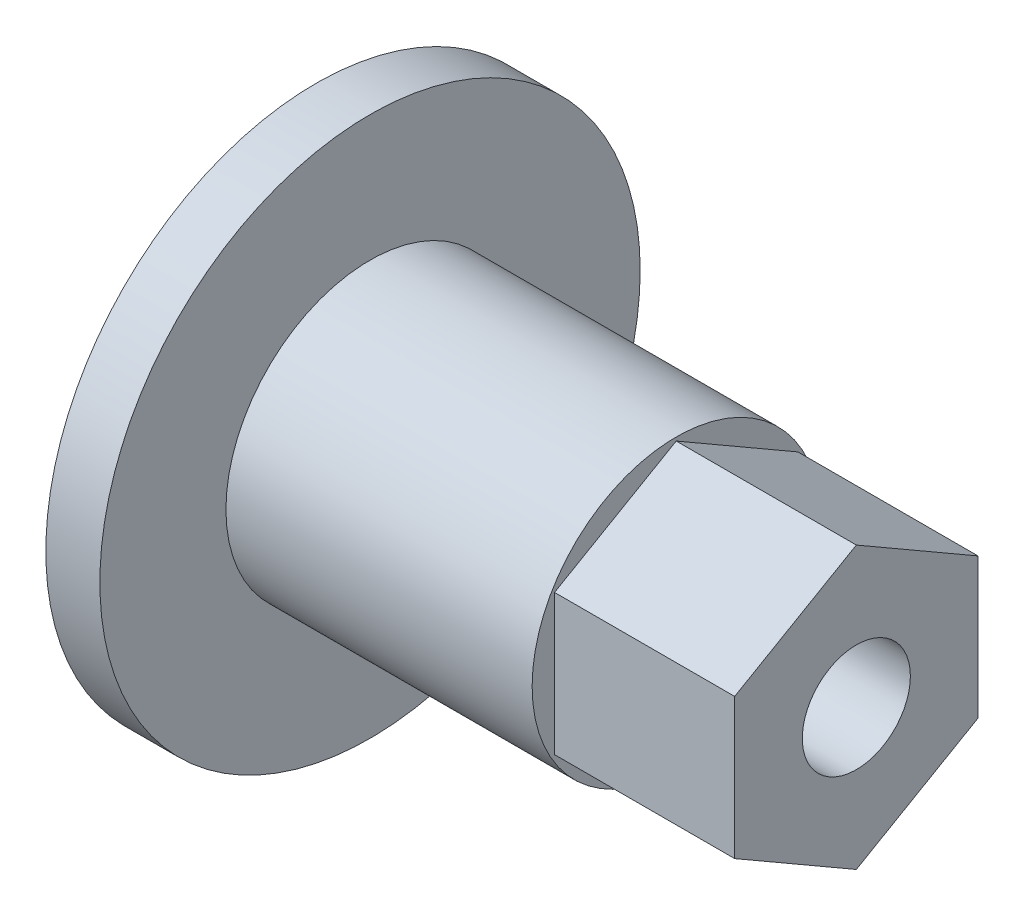
ISO-10303-21;
HEADER;
FILE_DESCRIPTION(('STEP AP214'),'2;1');
FILE_NAME('part.step','',(''),(''),'','','');
FILE_SCHEMA(('AUTOMOTIVE_DESIGN { 1 0 10303 214 1 1 1 1 }'));
ENDSEC;
DATA;
#1=APPLICATION_CONTEXT('core data for automotive mechanical design processes');
#2=APPLICATION_PROTOCOL_DEFINITION('international standard','automotive_design',2000,#1);
#3=PRODUCT_CONTEXT('',#1,'mechanical');
#4=PRODUCT('Part','Part','',(#3));
#5=PRODUCT_RELATED_PRODUCT_CATEGORY('part','',(#4));
#6=PRODUCT_DEFINITION_FORMATION('','',#4);
#7=PRODUCT_DEFINITION_CONTEXT('part definition',#1,'design');
#8=PRODUCT_DEFINITION('design','',#6,#7);
#9=PRODUCT_DEFINITION_SHAPE('','',#8);
#10=(LENGTH_UNIT() NAMED_UNIT(*) SI_UNIT(.MILLI.,.METRE.));
#11=(NAMED_UNIT(*) PLANE_ANGLE_UNIT() SI_UNIT($,.RADIAN.));
#12=(NAMED_UNIT(*) SI_UNIT($,.STERADIAN.) SOLID_ANGLE_UNIT());
#13=UNCERTAINTY_MEASURE_WITH_UNIT(LENGTH_MEASURE(1.E-05),#10,'distance_accuracy_value','');
#14=(GEOMETRIC_REPRESENTATION_CONTEXT(3) GLOBAL_UNCERTAINTY_ASSIGNED_CONTEXT((#13)) GLOBAL_UNIT_ASSIGNED_CONTEXT((#10,
#11,#12)) REPRESENTATION_CONTEXT('',''));
#15=CARTESIAN_POINT('',(0.,0.,0.));
#16=DIRECTION('',(0.,0.,1.));
#17=DIRECTION('',(1.,0.,0.));
#18=AXIS2_PLACEMENT_3D('',#15,#16,#17);
#19=CARTESIAN_POINT('',(6.50000000000001,0.,0.));
#20=DIRECTION('',(1.,0.,0.));
#21=DIRECTION('',(0.,0.,-1.));
#22=AXIS2_PLACEMENT_3D('',#19,#20,#21);
#23=CONICAL_SURFACE('',#22,1.25,1.02974425867665);
#24=CARTESIAN_POINT('',(6.50000000000001,0.,0.));
#25=DIRECTION('',(1.,0.,0.));
#26=DIRECTION('',(0.,0.,-1.));
#27=AXIS2_PLACEMENT_3D('',#24,#25,#26);
#28=CIRCLE('',#27,1.25);
#29=CARTESIAN_POINT('',(6.50000000000001,0.,-1.25));
#30=VERTEX_POINT('',#29);
#31=EDGE_CURVE('E117',#30,#30,#28,.T.);
#32=ORIENTED_EDGE('',*,*,#31,.T.);
#33=EDGE_LOOP('',(#32));
#34=FACE_BOUND('',#33,.T.);
#35=CARTESIAN_POINT('',(6.35,0.,0.));
#36=DIRECTION('',(-1.,0.,0.));
#37=DIRECTION('',(0.,0.,1.));
#38=AXIS2_PLACEMENT_3D('',#35,#36,#37);
#39=CIRCLE('',#38,1.00035807764741);
#40=CARTESIAN_POINT('',(6.35,0.,1.00035807764741));
#41=VERTEX_POINT('',#40);
#42=EDGE_CURVE('E38',#41,#41,#39,.F.);
#43=ORIENTED_EDGE('',*,*,#42,.F.);
#44=EDGE_LOOP('',(#43));
#45=FACE_BOUND('',#44,.T.);
#46=ADVANCED_FACE('F34',(#34,#45),#23,.F.);
#47=CARTESIAN_POINT('',(15.,0.,0.));
#48=DIRECTION('',(1.,0.,0.));
#49=DIRECTION('',(0.,0.,-1.));
#50=AXIS2_PLACEMENT_3D('',#47,#48,#49);
#51=CYLINDRICAL_SURFACE('',#50,4.);
#52=CARTESIAN_POINT('',(1.5,0.,0.));
#53=DIRECTION('',(1.,0.,0.));
#54=DIRECTION('',(0.,0.,-1.));
#55=AXIS2_PLACEMENT_3D('',#52,#53,#54);
#56=CIRCLE('',#55,4.);
#57=CARTESIAN_POINT('',(1.5,0.,-4.));
#58=VERTEX_POINT('',#57);
#59=EDGE_CURVE('E146',#58,#58,#56,.T.);
#60=ORIENTED_EDGE('',*,*,#59,.T.);
#61=EDGE_LOOP('',(#60));
#62=FACE_BOUND('',#61,.T.);
#63=CARTESIAN_POINT('',(10.,0.,0.));
#64=DIRECTION('',(1.,0.,0.));
#65=DIRECTION('',(0.,0.,-1.));
#66=AXIS2_PLACEMENT_3D('',#63,#64,#65);
#67=CIRCLE('',#66,4.);
#68=CARTESIAN_POINT('',(10.,0.,-4.));
#69=VERTEX_POINT('',#68);
#70=EDGE_CURVE('E138',#69,#69,#67,.F.);
#71=ORIENTED_EDGE('',*,*,#70,.T.);
#72=EDGE_LOOP('',(#71));
#73=FACE_BOUND('',#72,.T.);
#74=ADVANCED_FACE('F153',(#62,#73),#51,.T.);
#75=CARTESIAN_POINT('',(0.,0.,0.));
#76=DIRECTION('',(-1.,0.,0.));
#77=DIRECTION('',(0.,0.,1.));
#78=AXIS2_PLACEMENT_3D('',#75,#76,#77);
#79=PLANE('',#78);
#80=CARTESIAN_POINT('',(0.,0.,0.));
#81=DIRECTION('',(-1.,0.,0.));
#82=DIRECTION('',(0.,0.,1.));
#83=AXIS2_PLACEMENT_3D('',#80,#81,#82);
#84=CIRCLE('',#83,1.58496);
#85=CARTESIAN_POINT('',(0.,0.,1.58496));
#86=VERTEX_POINT('',#85);
#87=EDGE_CURVE('E225',#86,#86,#84,.T.);
#88=ORIENTED_EDGE('',*,*,#87,.F.);
#89=EDGE_LOOP('',(#88));
#90=FACE_BOUND('',#89,.T.);
#91=CARTESIAN_POINT('',(0.,0.,0.));
#92=DIRECTION('',(1.,0.,0.));
#93=DIRECTION('',(0.,0.,-1.));
#94=AXIS2_PLACEMENT_3D('',#91,#92,#93);
#95=CIRCLE('',#94,7.5);
#96=CARTESIAN_POINT('',(0.,0.,-7.5));
#97=VERTEX_POINT('',#96);
#98=EDGE_CURVE('E12',#97,#97,#95,.T.);
#99=ORIENTED_EDGE('',*,*,#98,.F.);
#100=EDGE_LOOP('',(#99));
#101=FACE_BOUND('',#100,.T.);
#102=ADVANCED_FACE('F36',(#90,#101),#79,.T.);
#103=CARTESIAN_POINT('',(15.,0.,0.));
#104=DIRECTION('',(1.,0.,0.));
#105=DIRECTION('',(0.,0.,-1.));
#106=AXIS2_PLACEMENT_3D('',#103,#104,#105);
#107=CYLINDRICAL_SURFACE('',#106,7.5);
#108=ORIENTED_EDGE('',*,*,#98,.T.);
#109=EDGE_LOOP('',(#108));
#110=FACE_BOUND('',#109,.T.);
#111=CARTESIAN_POINT('',(1.5,0.,0.));
#112=DIRECTION('',(1.,0.,0.));
#113=DIRECTION('',(0.,0.,-1.));
#114=AXIS2_PLACEMENT_3D('',#111,#112,#113);
#115=CIRCLE('',#114,7.5);
#116=CARTESIAN_POINT('',(1.5,0.,-7.5));
#117=VERTEX_POINT('',#116);
#118=EDGE_CURVE('E43',#117,#117,#115,.T.);
#119=ORIENTED_EDGE('',*,*,#118,.F.);
#120=EDGE_LOOP('',(#119));
#121=FACE_BOUND('',#120,.T.);
#122=ADVANCED_FACE('F164',(#110,#121),#107,.T.);
#123=CARTESIAN_POINT('',(1.5,0.,-7.5));
#124=DIRECTION('',(1.,0.,0.));
#125=DIRECTION('',(0.,0.,-1.));
#126=AXIS2_PLACEMENT_3D('',#123,#124,#125);
#127=PLANE('',#126);
#128=ORIENTED_EDGE('',*,*,#118,.T.);
#129=EDGE_LOOP('',(#128));
#130=FACE_BOUND('',#129,.T.);
#131=ORIENTED_EDGE('',*,*,#59,.F.);
#132=EDGE_LOOP('',(#131));
#133=FACE_BOUND('',#132,.T.);
#134=ADVANCED_FACE('F156',(#130,#133),#127,.T.);
#135=CARTESIAN_POINT('',(10.,0.,0.));
#136=DIRECTION('',(1.,0.,0.));
#137=DIRECTION('',(0.,0.,-1.));
#138=AXIS2_PLACEMENT_3D('',#135,#136,#137);
#139=PLANE('',#138);
#140=ORIENTED_EDGE('',*,*,#70,.F.);
#141=EDGE_LOOP('',(#140));
#142=FACE_BOUND('',#141,.T.);
#143=DIRECTION('',(0.,1.,0.));
#144=VECTOR('',#143,1.);
#145=CARTESIAN_POINT('',(10.,-1.95,-3.37749907475931));
#146=LINE('',#145,#144);
#147=CARTESIAN_POINT('',(10.,-1.95,-3.37749907475931));
#148=VERTEX_POINT('',#147);
#149=CARTESIAN_POINT('',(10.,1.95,-3.37749907475931));
#150=VERTEX_POINT('',#149);
#151=EDGE_CURVE('E101',#148,#150,#146,.T.);
#152=ORIENTED_EDGE('',*,*,#151,.F.);
#153=DIRECTION('',(0.,0.5,-0.866025403784439));
#154=VECTOR('',#153,1.);
#155=CARTESIAN_POINT('',(10.,-3.9,0.));
#156=LINE('',#155,#154);
#157=CARTESIAN_POINT('',(10.,-3.9,0.));
#158=VERTEX_POINT('',#157);
#159=EDGE_CURVE('E124',#158,#148,#156,.T.);
#160=ORIENTED_EDGE('',*,*,#159,.F.);
#161=DIRECTION('',(0.,-0.5,-0.866025403784438));
#162=VECTOR('',#161,1.);
#163=CARTESIAN_POINT('',(10.,-1.95,3.37749907475931));
#164=LINE('',#163,#162);
#165=CARTESIAN_POINT('',(10.,-1.95,3.37749907475931));
#166=VERTEX_POINT('',#165);
#167=EDGE_CURVE('E121',#166,#158,#164,.T.);
#168=ORIENTED_EDGE('',*,*,#167,.F.);
#169=DIRECTION('',(0.,-1.,0.));
#170=VECTOR('',#169,1.);
#171=CARTESIAN_POINT('',(10.,1.95,3.37749907475931));
#172=LINE('',#171,#170);
#173=CARTESIAN_POINT('',(10.,1.95,3.37749907475931));
#174=VERTEX_POINT('',#173);
#175=EDGE_CURVE('E59',#174,#166,#172,.T.);
#176=ORIENTED_EDGE('',*,*,#175,.F.);
#177=DIRECTION('',(0.,-0.5,0.866025403784439));
#178=VECTOR('',#177,1.);
#179=CARTESIAN_POINT('',(10.,3.9,0.));
#180=LINE('',#179,#178);
#181=CARTESIAN_POINT('',(10.,3.9,0.));
#182=VERTEX_POINT('',#181);
#183=EDGE_CURVE('E93',#182,#174,#180,.T.);
#184=ORIENTED_EDGE('',*,*,#183,.F.);
#185=DIRECTION('',(0.,0.5,0.866025403784439));
#186=VECTOR('',#185,1.);
#187=CARTESIAN_POINT('',(10.,1.95,-3.37749907475931));
#188=LINE('',#187,#186);
#189=EDGE_CURVE('E106',#150,#182,#188,.T.);
#190=ORIENTED_EDGE('',*,*,#189,.F.);
#191=EDGE_LOOP('',(#152,#160,#168,#176,#184,#190));
#192=FACE_BOUND('',#191,.T.);
#193=ADVANCED_FACE('F105',(#142,#192),#139,.T.);
#194=CARTESIAN_POINT('',(10.,1.95,-3.37749907475931));
#195=DIRECTION('',(0.,0.866025403784439,-0.5));
#196=DIRECTION('',(0.,0.5,0.866025403784439));
#197=AXIS2_PLACEMENT_3D('',#194,#195,#196);
#198=PLANE('',#197);
#199=DIRECTION('',(0.,0.5,0.866025403784439));
#200=VECTOR('',#199,1.);
#201=CARTESIAN_POINT('',(15.,1.95,-3.37749907475931));
#202=LINE('',#201,#200);
#203=CARTESIAN_POINT('',(15.,1.95,-3.37749907475931));
#204=VERTEX_POINT('',#203);
#205=CARTESIAN_POINT('',(15.,3.9,0.));
#206=VERTEX_POINT('',#205);
#207=EDGE_CURVE('E128',#204,#206,#202,.T.);
#208=ORIENTED_EDGE('',*,*,#207,.F.);
#209=DIRECTION('',(1.,0.,0.));
#210=VECTOR('',#209,1.);
#211=CARTESIAN_POINT('',(10.,1.95,-3.37749907475931));
#212=LINE('',#211,#210);
#213=EDGE_CURVE('E110',#150,#204,#212,.T.);
#214=ORIENTED_EDGE('',*,*,#213,.F.);
#215=ORIENTED_EDGE('',*,*,#189,.T.);
#216=DIRECTION('',(1.,0.,0.));
#217=VECTOR('',#216,1.);
#218=CARTESIAN_POINT('',(10.,3.9,0.));
#219=LINE('',#218,#217);
#220=EDGE_CURVE('E91',#182,#206,#219,.T.);
#221=ORIENTED_EDGE('',*,*,#220,.T.);
#222=EDGE_LOOP('',(#208,#214,#215,#221));
#223=FACE_BOUND('',#222,.T.);
#224=ADVANCED_FACE('F109',(#223),#198,.T.);
#225=CARTESIAN_POINT('',(10.,-1.95,-3.37749907475931));
#226=DIRECTION('',(0.,0.,-1.));
#227=DIRECTION('',(-1.,0.,0.));
#228=AXIS2_PLACEMENT_3D('',#225,#226,#227);
#229=PLANE('',#228);
#230=DIRECTION('',(0.,1.,0.));
#231=VECTOR('',#230,1.);
#232=CARTESIAN_POINT('',(15.,-1.95,-3.37749907475931));
#233=LINE('',#232,#231);
#234=CARTESIAN_POINT('',(15.,-1.95,-3.37749907475931));
#235=VERTEX_POINT('',#234);
#236=EDGE_CURVE('E111',#235,#204,#233,.T.);
#237=ORIENTED_EDGE('',*,*,#236,.F.);
#238=DIRECTION('',(1.,0.,0.));
#239=VECTOR('',#238,1.);
#240=CARTESIAN_POINT('',(10.,-1.95,-3.37749907475931));
#241=LINE('',#240,#239);
#242=EDGE_CURVE('E139',#148,#235,#241,.T.);
#243=ORIENTED_EDGE('',*,*,#242,.F.);
#244=ORIENTED_EDGE('',*,*,#151,.T.);
#245=ORIENTED_EDGE('',*,*,#213,.T.);
#246=EDGE_LOOP('',(#237,#243,#244,#245));
#247=FACE_BOUND('',#246,.T.);
#248=ADVANCED_FACE('F162',(#247),#229,.T.);
#249=CARTESIAN_POINT('',(10.,-3.9,0.));
#250=DIRECTION('',(0.,-0.866025403784439,-0.5));
#251=DIRECTION('',(0.,0.5,-0.866025403784439));
#252=AXIS2_PLACEMENT_3D('',#249,#250,#251);
#253=PLANE('',#252);
#254=DIRECTION('',(0.,0.5,-0.866025403784439));
#255=VECTOR('',#254,1.);
#256=CARTESIAN_POINT('',(15.,-3.9,0.));
#257=LINE('',#256,#255);
#258=CARTESIAN_POINT('',(15.,-3.9,0.));
#259=VERTEX_POINT('',#258);
#260=EDGE_CURVE('E114',#259,#235,#257,.T.);
#261=ORIENTED_EDGE('',*,*,#260,.F.);
#262=DIRECTION('',(1.,0.,0.));
#263=VECTOR('',#262,1.);
#264=CARTESIAN_POINT('',(10.,-3.9,0.));
#265=LINE('',#264,#263);
#266=EDGE_CURVE('E141',#158,#259,#265,.T.);
#267=ORIENTED_EDGE('',*,*,#266,.F.);
#268=ORIENTED_EDGE('',*,*,#159,.T.);
#269=ORIENTED_EDGE('',*,*,#242,.T.);
#270=EDGE_LOOP('',(#261,#267,#268,#269));
#271=FACE_BOUND('',#270,.T.);
#272=ADVANCED_FACE('F184',(#271),#253,.T.);
#273=CARTESIAN_POINT('',(10.,-1.95,3.37749907475931));
#274=DIRECTION('',(0.,-0.866025403784438,0.5));
#275=DIRECTION('',(0.,-0.5,-0.866025403784438));
#276=AXIS2_PLACEMENT_3D('',#273,#274,#275);
#277=PLANE('',#276);
#278=DIRECTION('',(0.,-0.5,-0.866025403784438));
#279=VECTOR('',#278,1.);
#280=CARTESIAN_POINT('',(15.,-1.95,3.37749907475931));
#281=LINE('',#280,#279);
#282=CARTESIAN_POINT('',(15.,-1.95,3.37749907475931));
#283=VERTEX_POINT('',#282);
#284=EDGE_CURVE('E132',#283,#259,#281,.T.);
#285=ORIENTED_EDGE('',*,*,#284,.F.);
#286=DIRECTION('',(1.,0.,0.));
#287=VECTOR('',#286,1.);
#288=CARTESIAN_POINT('',(10.,-1.95,3.37749907475931));
#289=LINE('',#288,#287);
#290=EDGE_CURVE('E143',#166,#283,#289,.T.);
#291=ORIENTED_EDGE('',*,*,#290,.F.);
#292=ORIENTED_EDGE('',*,*,#167,.T.);
#293=ORIENTED_EDGE('',*,*,#266,.T.);
#294=EDGE_LOOP('',(#285,#291,#292,#293));
#295=FACE_BOUND('',#294,.T.);
#296=ADVANCED_FACE('F188',(#295),#277,.T.);
#297=CARTESIAN_POINT('',(10.,1.95,3.37749907475931));
#298=DIRECTION('',(0.,0.,1.));
#299=DIRECTION('',(0.,-1.,0.));
#300=AXIS2_PLACEMENT_3D('',#297,#298,#299);
#301=PLANE('',#300);
#302=DIRECTION('',(0.,-1.,0.));
#303=VECTOR('',#302,1.);
#304=CARTESIAN_POINT('',(15.,1.95,3.37749907475931));
#305=LINE('',#304,#303);
#306=CARTESIAN_POINT('',(15.,1.95,3.37749907475931));
#307=VERTEX_POINT('',#306);
#308=EDGE_CURVE('E51',#307,#283,#305,.T.);
#309=ORIENTED_EDGE('',*,*,#308,.F.);
#310=DIRECTION('',(1.,0.,0.));
#311=VECTOR('',#310,1.);
#312=CARTESIAN_POINT('',(10.,1.95,3.37749907475931));
#313=LINE('',#312,#311);
#314=EDGE_CURVE('E100',#174,#307,#313,.T.);
#315=ORIENTED_EDGE('',*,*,#314,.F.);
#316=ORIENTED_EDGE('',*,*,#175,.T.);
#317=ORIENTED_EDGE('',*,*,#290,.T.);
#318=EDGE_LOOP('',(#309,#315,#316,#317));
#319=FACE_BOUND('',#318,.T.);
#320=ADVANCED_FACE('F192',(#319),#301,.T.);
#321=CARTESIAN_POINT('',(10.,3.9,0.));
#322=DIRECTION('',(0.,0.866025403784439,0.5));
#323=DIRECTION('',(0.,-0.5,0.866025403784439));
#324=AXIS2_PLACEMENT_3D('',#321,#322,#323);
#325=PLANE('',#324);
#326=DIRECTION('',(0.,-0.5,0.866025403784439));
#327=VECTOR('',#326,1.);
#328=CARTESIAN_POINT('',(15.,3.9,0.));
#329=LINE('',#328,#327);
#330=EDGE_CURVE('E95',#206,#307,#329,.T.);
#331=ORIENTED_EDGE('',*,*,#330,.F.);
#332=ORIENTED_EDGE('',*,*,#220,.F.);
#333=ORIENTED_EDGE('',*,*,#183,.T.);
#334=ORIENTED_EDGE('',*,*,#314,.T.);
#335=EDGE_LOOP('',(#331,#332,#333,#334));
#336=FACE_BOUND('',#335,.T.);
#337=ADVANCED_FACE('F92',(#336),#325,.T.);
#338=CARTESIAN_POINT('',(15.,0.,-4.));
#339=DIRECTION('',(1.,0.,0.));
#340=DIRECTION('',(0.,0.,-1.));
#341=AXIS2_PLACEMENT_3D('',#338,#339,#340);
#342=PLANE('',#341);
#343=CARTESIAN_POINT('',(15.,0.,0.));
#344=DIRECTION('',(1.,0.,0.));
#345=DIRECTION('',(0.,0.,-1.));
#346=AXIS2_PLACEMENT_3D('',#343,#344,#345);
#347=CIRCLE('',#346,1.49999999999999);
#348=CARTESIAN_POINT('',(15.,0.,-1.5));
#349=VERTEX_POINT('',#348);
#350=EDGE_CURVE('E232',#349,#349,#347,.T.);
#351=ORIENTED_EDGE('',*,*,#350,.F.);
#352=EDGE_LOOP('',(#351));
#353=FACE_BOUND('',#352,.T.);
#354=ORIENTED_EDGE('',*,*,#236,.T.);
#355=ORIENTED_EDGE('',*,*,#207,.T.);
#356=ORIENTED_EDGE('',*,*,#330,.T.);
#357=ORIENTED_EDGE('',*,*,#308,.T.);
#358=ORIENTED_EDGE('',*,*,#284,.T.);
#359=ORIENTED_EDGE('',*,*,#260,.T.);
#360=EDGE_LOOP('',(#354,#355,#356,#357,#358,#359));
#361=FACE_BOUND('',#360,.T.);
#362=ADVANCED_FACE('F197',(#353,#361),#342,.T.);
#363=CARTESIAN_POINT('',(15.,0.,0.));
#364=DIRECTION('',(1.,0.,0.));
#365=DIRECTION('',(0.,0.,-1.));
#366=AXIS2_PLACEMENT_3D('',#363,#364,#365);
#367=CYLINDRICAL_SURFACE('',#366,1.25);
#368=ORIENTED_EDGE('',*,*,#31,.F.);
#369=EDGE_LOOP('',(#368));
#370=FACE_BOUND('',#369,.T.);
#371=CARTESIAN_POINT('',(9.,0.,0.));
#372=DIRECTION('',(1.,0.,0.));
#373=DIRECTION('',(0.,0.,-1.));
#374=AXIS2_PLACEMENT_3D('',#371,#372,#373);
#375=CIRCLE('',#374,1.25);
#376=CARTESIAN_POINT('',(9.,0.,-1.25));
#377=VERTEX_POINT('',#376);
#378=EDGE_CURVE('E237',#377,#377,#375,.T.);
#379=ORIENTED_EDGE('',*,*,#378,.T.);
#380=EDGE_LOOP('',(#379));
#381=FACE_BOUND('',#380,.T.);
#382=ADVANCED_FACE('F180',(#370,#381),#367,.F.);
#383=CARTESIAN_POINT('',(9.,1.25,0.));
#384=DIRECTION('',(-1.,0.,0.));
#385=DIRECTION('',(0.,0.,1.));
#386=AXIS2_PLACEMENT_3D('',#383,#384,#385);
#387=PLANE('',#386);
#388=ORIENTED_EDGE('',*,*,#378,.F.);
#389=EDGE_LOOP('',(#388));
#390=FACE_BOUND('',#389,.T.);
#391=CARTESIAN_POINT('',(9.,0.,0.));
#392=DIRECTION('',(1.,0.,0.));
#393=DIRECTION('',(0.,0.,-1.));
#394=AXIS2_PLACEMENT_3D('',#391,#392,#393);
#395=CIRCLE('',#394,1.49999999999999);
#396=CARTESIAN_POINT('',(9.,0.,-1.5));
#397=VERTEX_POINT('',#396);
#398=EDGE_CURVE('E235',#397,#397,#395,.T.);
#399=ORIENTED_EDGE('',*,*,#398,.T.);
#400=EDGE_LOOP('',(#399));
#401=FACE_BOUND('',#400,.T.);
#402=ADVANCED_FACE('F205',(#390,#401),#387,.F.);
#403=CARTESIAN_POINT('',(15.,0.,0.));
#404=DIRECTION('',(1.,0.,0.));
#405=DIRECTION('',(0.,0.,-1.));
#406=AXIS2_PLACEMENT_3D('',#403,#404,#405);
#407=CYLINDRICAL_SURFACE('',#406,1.49999999999999);
#408=ORIENTED_EDGE('',*,*,#398,.F.);
#409=EDGE_LOOP('',(#408));
#410=FACE_BOUND('',#409,.T.);
#411=ORIENTED_EDGE('',*,*,#350,.T.);
#412=EDGE_LOOP('',(#411));
#413=FACE_BOUND('',#412,.T.);
#414=ADVANCED_FACE('F245',(#410,#413),#407,.F.);
#415=CARTESIAN_POINT('',(6.35,0.,0.));
#416=DIRECTION('',(-1.,0.,0.));
#417=DIRECTION('',(0.,0.,1.));
#418=AXIS2_PLACEMENT_3D('',#415,#416,#417);
#419=PLANE('',#418);
#420=CARTESIAN_POINT('',(6.35,0.,0.));
#421=DIRECTION('',(-1.,0.,0.));
#422=DIRECTION('',(0.,0.,1.));
#423=AXIS2_PLACEMENT_3D('',#420,#421,#422);
#424=CIRCLE('',#423,1.58496);
#425=CARTESIAN_POINT('',(6.35,0.,1.58496));
#426=VERTEX_POINT('',#425);
#427=EDGE_CURVE('E227',#426,#426,#424,.T.);
#428=ORIENTED_EDGE('',*,*,#427,.T.);
#429=EDGE_LOOP('',(#428));
#430=FACE_BOUND('',#429,.T.);
#431=ORIENTED_EDGE('',*,*,#42,.T.);
#432=EDGE_LOOP('',(#431));
#433=FACE_BOUND('',#432,.T.);
#434=ADVANCED_FACE('F250',(#430,#433),#419,.T.);
#435=CARTESIAN_POINT('',(6.35,0.,0.));
#436=DIRECTION('',(-1.,0.,0.));
#437=DIRECTION('',(0.,0.,1.));
#438=AXIS2_PLACEMENT_3D('',#435,#436,#437);
#439=CYLINDRICAL_SURFACE('',#438,1.58496);
#440=ORIENTED_EDGE('',*,*,#427,.F.);
#441=EDGE_LOOP('',(#440));
#442=FACE_BOUND('',#441,.T.);
#443=ORIENTED_EDGE('',*,*,#87,.T.);
#444=EDGE_LOOP('',(#443));
#445=FACE_BOUND('',#444,.T.);
#446=ADVANCED_FACE('F255',(#442,#445),#439,.F.);
#447=CLOSED_SHELL('',(#46,#74,#102,#122,#134,#193,#224,#248,#272,#296,#320,#337,#362,#382,#402,
#414,#434,#446));
#448=MANIFOLD_SOLID_BREP('B2',#447);
#449=ADVANCED_BREP_SHAPE_REPRESENTATION('',(#18,#448),#14);
#450=SHAPE_DEFINITION_REPRESENTATION(#9,#449);
ENDSEC;
END-ISO-10303-21;
